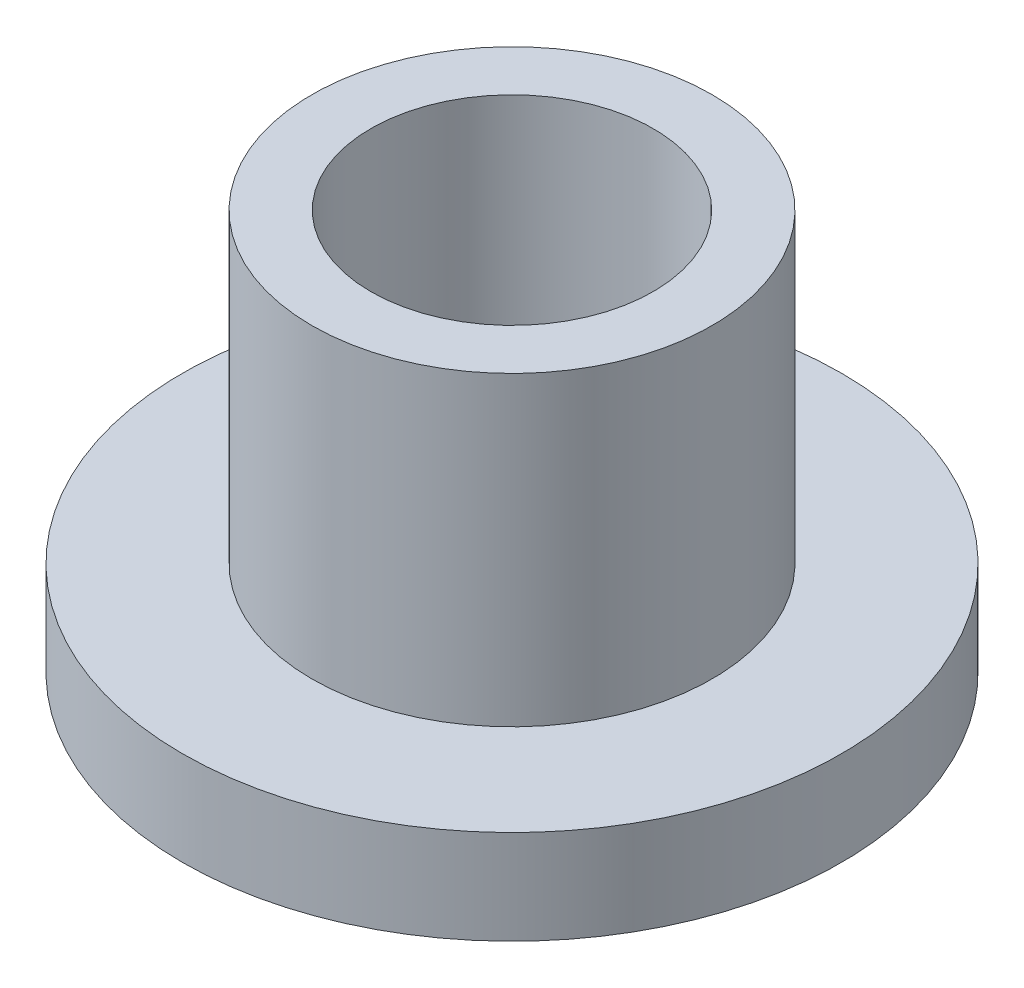
ISO-10303-21;
HEADER;
FILE_DESCRIPTION(('STEP AP214'),'2;1');
FILE_NAME('part.step','',(''),(''),'','','');
FILE_SCHEMA(('AUTOMOTIVE_DESIGN { 1 0 10303 214 1 1 1 1 }'));
ENDSEC;
DATA;
#1=APPLICATION_CONTEXT('core data for automotive mechanical design processes');
#2=APPLICATION_PROTOCOL_DEFINITION('international standard','automotive_design',2000,#1);
#3=PRODUCT_CONTEXT('',#1,'mechanical');
#4=PRODUCT('Part','Part','',(#3));
#5=PRODUCT_RELATED_PRODUCT_CATEGORY('part','',(#4));
#6=PRODUCT_DEFINITION_FORMATION('','',#4);
#7=PRODUCT_DEFINITION_CONTEXT('part definition',#1,'design');
#8=PRODUCT_DEFINITION('design','',#6,#7);
#9=PRODUCT_DEFINITION_SHAPE('','',#8);
#10=(LENGTH_UNIT() NAMED_UNIT(*) SI_UNIT(.MILLI.,.METRE.));
#11=(NAMED_UNIT(*) PLANE_ANGLE_UNIT() SI_UNIT($,.RADIAN.));
#12=(NAMED_UNIT(*) SI_UNIT($,.STERADIAN.) SOLID_ANGLE_UNIT());
#13=UNCERTAINTY_MEASURE_WITH_UNIT(LENGTH_MEASURE(1.E-05),#10,'distance_accuracy_value','');
#14=(GEOMETRIC_REPRESENTATION_CONTEXT(3) GLOBAL_UNCERTAINTY_ASSIGNED_CONTEXT((#13)) GLOBAL_UNIT_ASSIGNED_CONTEXT((#10,
#11,#12)) REPRESENTATION_CONTEXT('',''));
#15=CARTESIAN_POINT('',(0.,0.,0.));
#16=DIRECTION('',(0.,0.,1.));
#17=DIRECTION('',(1.,0.,0.));
#18=AXIS2_PLACEMENT_3D('',#15,#16,#17);
#19=CARTESIAN_POINT('',(0.,2.,0.));
#20=DIRECTION('',(0.,-1.,0.));
#21=DIRECTION('',(0.,0.,-1.));
#22=AXIS2_PLACEMENT_3D('',#19,#20,#21);
#23=CYLINDRICAL_SURFACE('',#22,7.);
#24=CARTESIAN_POINT('',(0.,2.,0.));
#25=DIRECTION('',(0.,1.,0.));
#26=DIRECTION('',(0.,0.,1.));
#27=AXIS2_PLACEMENT_3D('',#24,#25,#26);
#28=CIRCLE('',#27,7.);
#29=CARTESIAN_POINT('',(0.,2.,7.));
#30=VERTEX_POINT('',#29);
#31=EDGE_CURVE('E40',#30,#30,#28,.T.);
#32=ORIENTED_EDGE('',*,*,#31,.F.);
#33=EDGE_LOOP('',(#32));
#34=FACE_BOUND('',#33,.T.);
#35=CARTESIAN_POINT('',(0.,0.,0.));
#36=DIRECTION('',(0.,1.,0.));
#37=DIRECTION('',(0.,0.,1.));
#38=AXIS2_PLACEMENT_3D('',#35,#36,#37);
#39=CIRCLE('',#38,7.);
#40=CARTESIAN_POINT('',(0.,0.,7.));
#41=VERTEX_POINT('',#40);
#42=EDGE_CURVE('E36',#41,#41,#39,.T.);
#43=ORIENTED_EDGE('',*,*,#42,.T.);
#44=EDGE_LOOP('',(#43));
#45=FACE_BOUND('',#44,.T.);
#46=ADVANCED_FACE('F33',(#34,#45),#23,.T.);
#47=CARTESIAN_POINT('',(0.,2.,0.));
#48=DIRECTION('',(0.,1.,0.));
#49=DIRECTION('',(0.,0.,1.));
#50=AXIS2_PLACEMENT_3D('',#47,#48,#49);
#51=PLANE('',#50);
#52=CARTESIAN_POINT('',(0.,2.,0.));
#53=DIRECTION('',(0.,1.,0.));
#54=DIRECTION('',(0.,0.,1.));
#55=AXIS2_PLACEMENT_3D('',#52,#53,#54);
#56=CIRCLE('',#55,4.25);
#57=CARTESIAN_POINT('',(0.,2.,-4.25));
#58=VERTEX_POINT('',#57);
#59=EDGE_CURVE('E10',#58,#58,#56,.T.);
#60=ORIENTED_EDGE('',*,*,#59,.F.);
#61=EDGE_LOOP('',(#60));
#62=FACE_BOUND('',#61,.T.);
#63=ORIENTED_EDGE('',*,*,#31,.T.);
#64=EDGE_LOOP('',(#63));
#65=FACE_BOUND('',#64,.T.);
#66=ADVANCED_FACE('F72',(#62,#65),#51,.T.);
#67=CARTESIAN_POINT('',(0.,0.,0.));
#68=DIRECTION('',(0.,1.,0.));
#69=DIRECTION('',(0.,0.,1.));
#70=AXIS2_PLACEMENT_3D('',#67,#68,#69);
#71=PLANE('',#70);
#72=CARTESIAN_POINT('',(0.,0.,0.));
#73=DIRECTION('',(0.,1.,0.));
#74=DIRECTION('',(0.,0.,1.));
#75=AXIS2_PLACEMENT_3D('',#72,#73,#74);
#76=CIRCLE('',#75,3.);
#77=CARTESIAN_POINT('',(0.,0.,3.));
#78=VERTEX_POINT('',#77);
#79=EDGE_CURVE('E49',#78,#78,#76,.F.);
#80=ORIENTED_EDGE('',*,*,#79,.F.);
#81=EDGE_LOOP('',(#80));
#82=FACE_BOUND('',#81,.T.);
#83=ORIENTED_EDGE('',*,*,#42,.F.);
#84=EDGE_LOOP('',(#83));
#85=FACE_BOUND('',#84,.T.);
#86=ADVANCED_FACE('F67',(#82,#85),#71,.F.);
#87=CARTESIAN_POINT('',(0.,8.5,0.));
#88=DIRECTION('',(0.,-1.,0.));
#89=DIRECTION('',(0.,0.,-1.));
#90=AXIS2_PLACEMENT_3D('',#87,#88,#89);
#91=CYLINDRICAL_SURFACE('',#90,4.25);
#92=CARTESIAN_POINT('',(0.,8.5,0.));
#93=DIRECTION('',(0.,1.,0.));
#94=DIRECTION('',(0.,0.,1.));
#95=AXIS2_PLACEMENT_3D('',#92,#93,#94);
#96=CIRCLE('',#95,4.25);
#97=CARTESIAN_POINT('',(0.,8.5,-4.25));
#98=VERTEX_POINT('',#97);
#99=EDGE_CURVE('E46',#98,#98,#96,.T.);
#100=CARTESIAN_POINT('',(0.,8.5,-4.25));
#101=CARTESIAN_POINT('',(0.,8.43229166666667,-4.25));
#102=CARTESIAN_POINT('',(0.,8.36458333333333,-4.25));
#103=CARTESIAN_POINT('',(0.,8.22916666666667,-4.25));
#104=CARTESIAN_POINT('',(0.,8.16145833333333,-4.25));
#105=CARTESIAN_POINT('',(0.,8.02604166666667,-4.25));
#106=CARTESIAN_POINT('',(0.,7.95833333333333,-4.25));
#107=CARTESIAN_POINT('',(0.,7.82291666666667,-4.25));
#108=CARTESIAN_POINT('',(0.,7.75520833333333,-4.25));
#109=CARTESIAN_POINT('',(0.,7.61979166666667,-4.25));
#110=CARTESIAN_POINT('',(0.,7.55208333333333,-4.25));
#111=CARTESIAN_POINT('',(0.,7.41666666666667,-4.25));
#112=CARTESIAN_POINT('',(0.,7.34895833333333,-4.25));
#113=CARTESIAN_POINT('',(0.,7.21354166666667,-4.25));
#114=CARTESIAN_POINT('',(0.,7.14583333333333,-4.25));
#115=CARTESIAN_POINT('',(0.,7.01041666666667,-4.25));
#116=CARTESIAN_POINT('',(0.,6.94270833333333,-4.25));
#117=CARTESIAN_POINT('',(0.,6.80729166666667,-4.25));
#118=CARTESIAN_POINT('',(0.,6.73958333333333,-4.25));
#119=CARTESIAN_POINT('',(0.,6.60416666666667,-4.25));
#120=CARTESIAN_POINT('',(0.,6.53645833333333,-4.25));
#121=CARTESIAN_POINT('',(0.,6.40104166666667,-4.25));
#122=CARTESIAN_POINT('',(0.,6.33333333333333,-4.25));
#123=CARTESIAN_POINT('',(0.,6.19791666666667,-4.25));
#124=CARTESIAN_POINT('',(0.,6.13020833333333,-4.25));
#125=CARTESIAN_POINT('',(0.,5.99479166666667,-4.25));
#126=CARTESIAN_POINT('',(0.,5.92708333333333,-4.25));
#127=CARTESIAN_POINT('',(0.,5.79166666666667,-4.25));
#128=CARTESIAN_POINT('',(0.,5.72395833333333,-4.25));
#129=CARTESIAN_POINT('',(0.,5.58854166666667,-4.25));
#130=CARTESIAN_POINT('',(0.,5.52083333333333,-4.25));
#131=CARTESIAN_POINT('',(0.,5.38541666666667,-4.25));
#132=CARTESIAN_POINT('',(0.,5.31770833333333,-4.25));
#133=CARTESIAN_POINT('',(0.,5.18229166666667,-4.25));
#134=CARTESIAN_POINT('',(0.,5.11458333333333,-4.25));
#135=CARTESIAN_POINT('',(0.,4.97916666666667,-4.25));
#136=CARTESIAN_POINT('',(0.,4.91145833333333,-4.25));
#137=CARTESIAN_POINT('',(0.,4.77604166666667,-4.25));
#138=CARTESIAN_POINT('',(0.,4.70833333333333,-4.25));
#139=CARTESIAN_POINT('',(0.,4.57291666666667,-4.25));
#140=CARTESIAN_POINT('',(0.,4.50520833333333,-4.25));
#141=CARTESIAN_POINT('',(0.,4.36979166666667,-4.25));
#142=CARTESIAN_POINT('',(0.,4.30208333333333,-4.25));
#143=CARTESIAN_POINT('',(0.,4.16666666666667,-4.25));
#144=CARTESIAN_POINT('',(0.,4.09895833333333,-4.25));
#145=CARTESIAN_POINT('',(0.,3.96354166666667,-4.25));
#146=CARTESIAN_POINT('',(0.,3.89583333333333,-4.25));
#147=CARTESIAN_POINT('',(0.,3.76041666666667,-4.25));
#148=CARTESIAN_POINT('',(0.,3.69270833333333,-4.25));
#149=CARTESIAN_POINT('',(0.,3.55729166666667,-4.25));
#150=CARTESIAN_POINT('',(0.,3.48958333333333,-4.25));
#151=CARTESIAN_POINT('',(0.,3.35416666666667,-4.25));
#152=CARTESIAN_POINT('',(0.,3.28645833333333,-4.25));
#153=CARTESIAN_POINT('',(0.,3.15104166666667,-4.25));
#154=CARTESIAN_POINT('',(0.,3.08333333333333,-4.25));
#155=CARTESIAN_POINT('',(0.,2.94791666666667,-4.25));
#156=CARTESIAN_POINT('',(0.,2.88020833333333,-4.25));
#157=CARTESIAN_POINT('',(0.,2.74479166666667,-4.25));
#158=CARTESIAN_POINT('',(0.,2.67708333333333,-4.25));
#159=CARTESIAN_POINT('',(0.,2.54166666666667,-4.25));
#160=CARTESIAN_POINT('',(0.,2.47395833333333,-4.25));
#161=CARTESIAN_POINT('',(0.,2.33854166666667,-4.25));
#162=CARTESIAN_POINT('',(0.,2.27083333333333,-4.25));
#163=CARTESIAN_POINT('',(0.,2.13541666666667,-4.25));
#164=CARTESIAN_POINT('',(0.,2.06770833333333,-4.25));
#165=CARTESIAN_POINT('',(0.,2.,-4.25));
#166=B_SPLINE_CURVE_WITH_KNOTS('',3,(#100,#101,#102,#103,#104,#105,#106,#107,#108,#109,#110,
#111,#112,#113,#114,#115,#116,#117,#118,#119,#120,#121,#122,#123,#124,#125,#126,#127,#128,#129,
#130,#131,#132,#133,#134,#135,#136,#137,#138,#139,#140,#141,#142,#143,#144,#145,#146,#147,#148,
#149,#150,#151,#152,#153,#154,#155,#156,#157,#158,#159,#160,#161,#162,#163,#164,#165),
.UNSPECIFIED.,.F.,.F.,(4,2,2,2,2,2,2,2,2,2,2,2,2,2,2,2,2,2,2,2,2,2,2,2,2,2,2,2,2,2,2,2,4),(0.,
0.203124999999998,0.406249999999999,0.609374999999999,0.812499999999999,1.015625,1.21875,
1.421875,1.625,1.828125,2.03125,2.234375,2.4375,2.640625,2.84375,3.046875,3.25,3.453125,3.65625,
3.859375,4.0625,4.265625,4.46875,4.671875,4.875,5.078125,5.28125,5.484375,5.6875,5.890625,
6.09375,6.296875,6.5),.UNSPECIFIED.);
#167=EDGE_CURVE('BSEAM62',#98,#58,#166,.T.);
#168=ORIENTED_EDGE('',*,*,#99,.F.);
#169=ORIENTED_EDGE('',*,*,#59,.T.);
#170=ORIENTED_EDGE('',*,*,#167,.T.);
#171=ORIENTED_EDGE('',*,*,#167,.F.);
#172=EDGE_LOOP('',(#168,#170,#169,#171));
#173=FACE_BOUND('',#172,.T.);
#174=ADVANCED_FACE('F62',(#173),#91,.T.);
#175=CARTESIAN_POINT('',(0.,8.5,0.));
#176=DIRECTION('',(0.,1.,0.));
#177=DIRECTION('',(0.,0.,1.));
#178=AXIS2_PLACEMENT_3D('',#175,#176,#177);
#179=PLANE('',#178);
#180=CARTESIAN_POINT('',(0.,8.5,0.));
#181=DIRECTION('',(0.,1.,0.));
#182=DIRECTION('',(0.,0.,1.));
#183=AXIS2_PLACEMENT_3D('',#180,#181,#182);
#184=CIRCLE('',#183,3.);
#185=CARTESIAN_POINT('',(0.,8.5,3.));
#186=VERTEX_POINT('',#185);
#187=EDGE_CURVE('E52',#186,#186,#184,.T.);
#188=ORIENTED_EDGE('',*,*,#187,.F.);
#189=EDGE_LOOP('',(#188));
#190=FACE_BOUND('',#189,.T.);
#191=ORIENTED_EDGE('',*,*,#99,.T.);
#192=EDGE_LOOP('',(#191));
#193=FACE_BOUND('',#192,.T.);
#194=ADVANCED_FACE('F59',(#190,#193),#179,.T.);
#195=CARTESIAN_POINT('',(0.,-0.000999999999999265,0.));
#196=DIRECTION('',(0.,1.,0.));
#197=DIRECTION('',(0.,0.,1.));
#198=AXIS2_PLACEMENT_3D('',#195,#196,#197);
#199=CYLINDRICAL_SURFACE('',#198,3.);
#200=ORIENTED_EDGE('',*,*,#187,.T.);
#201=EDGE_LOOP('',(#200));
#202=FACE_BOUND('',#201,.T.);
#203=ORIENTED_EDGE('',*,*,#79,.T.);
#204=EDGE_LOOP('',(#203));
#205=FACE_BOUND('',#204,.T.);
#206=ADVANCED_FACE('F56',(#202,#205),#199,.F.);
#207=CLOSED_SHELL('',(#46,#66,#86,#174,#194,#206));
#208=MANIFOLD_SOLID_BREP('B2',#207);
#209=ADVANCED_BREP_SHAPE_REPRESENTATION('',(#18,#208),#14);
#210=SHAPE_DEFINITION_REPRESENTATION(#9,#209);
ENDSEC;
END-ISO-10303-21;
